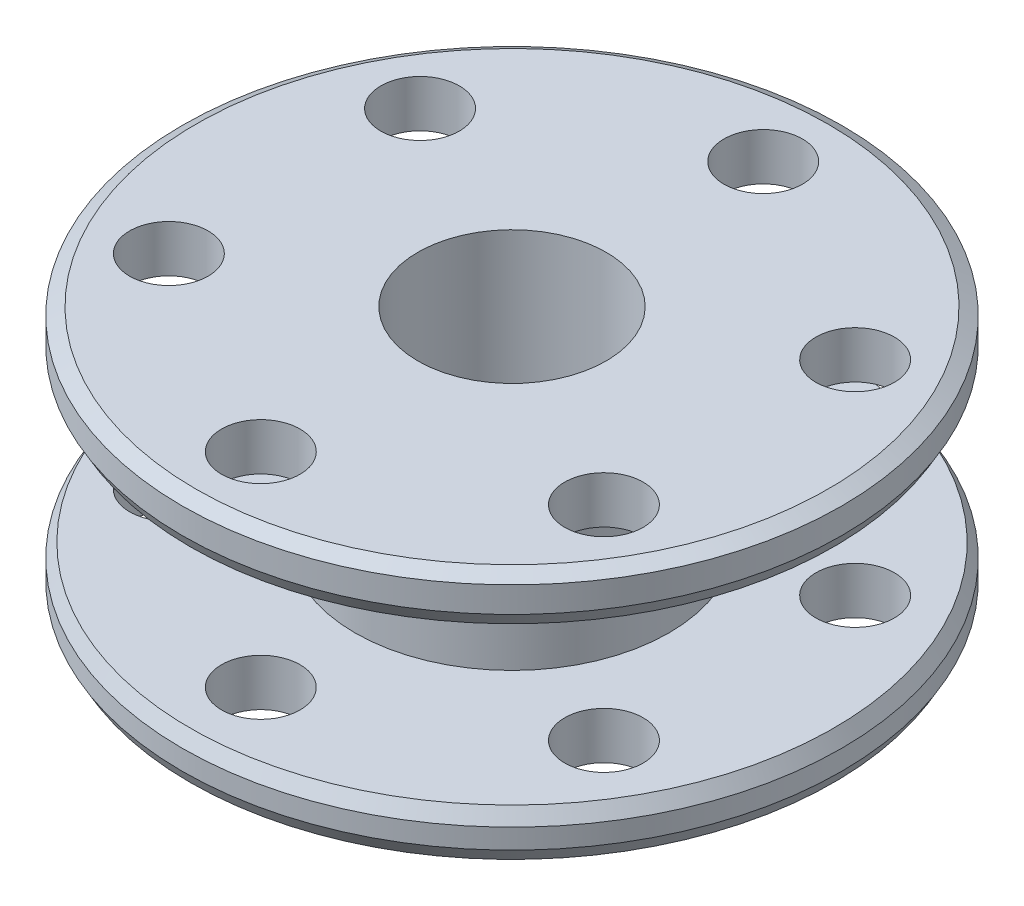
ISO-10303-21;
HEADER;
FILE_DESCRIPTION(('STEP AP214'),'2;1');
FILE_NAME('part.step','',(''),(''),'','','');
FILE_SCHEMA(('AUTOMOTIVE_DESIGN { 1 0 10303 214 1 1 1 1 }'));
ENDSEC;
DATA;
#1=APPLICATION_CONTEXT('core data for automotive mechanical design processes');
#2=APPLICATION_PROTOCOL_DEFINITION('international standard','automotive_design',2000,#1);
#3=PRODUCT_CONTEXT('',#1,'mechanical');
#4=PRODUCT('Part','Part','',(#3));
#5=PRODUCT_RELATED_PRODUCT_CATEGORY('part','',(#4));
#6=PRODUCT_DEFINITION_FORMATION('','',#4);
#7=PRODUCT_DEFINITION_CONTEXT('part definition',#1,'design');
#8=PRODUCT_DEFINITION('design','',#6,#7);
#9=PRODUCT_DEFINITION_SHAPE('','',#8);
#10=(LENGTH_UNIT() NAMED_UNIT(*) SI_UNIT(.MILLI.,.METRE.));
#11=(NAMED_UNIT(*) PLANE_ANGLE_UNIT() SI_UNIT($,.RADIAN.));
#12=(NAMED_UNIT(*) SI_UNIT($,.STERADIAN.) SOLID_ANGLE_UNIT());
#13=UNCERTAINTY_MEASURE_WITH_UNIT(LENGTH_MEASURE(1.E-05),#10,'distance_accuracy_value','');
#14=(GEOMETRIC_REPRESENTATION_CONTEXT(3) GLOBAL_UNCERTAINTY_ASSIGNED_CONTEXT((#13)) GLOBAL_UNIT_ASSIGNED_CONTEXT((#10,
#11,#12)) REPRESENTATION_CONTEXT('',''));
#15=CARTESIAN_POINT('',(0.,0.,0.));
#16=DIRECTION('',(0.,0.,1.));
#17=DIRECTION('',(1.,0.,0.));
#18=AXIS2_PLACEMENT_3D('',#15,#16,#17);
#19=CARTESIAN_POINT('',(0.,16.,0.));
#20=DIRECTION('',(0.,-1.,0.));
#21=DIRECTION('',(0.,0.,-1.));
#22=AXIS2_PLACEMENT_3D('',#19,#20,#21);
#23=CYLINDRICAL_SURFACE('',#22,21.);
#24=CARTESIAN_POINT('',(0.,0.86602540378445,0.));
#25=DIRECTION('',(0.,1.,0.));
#26=DIRECTION('',(0.,0.,1.));
#27=AXIS2_PLACEMENT_3D('',#24,#25,#26);
#28=CIRCLE('',#27,21.);
#29=CARTESIAN_POINT('',(0.,0.86602540378445,21.));
#30=VERTEX_POINT('',#29);
#31=EDGE_CURVE('E59',#30,#30,#28,.T.);
#32=ORIENTED_EDGE('',*,*,#31,.T.);
#33=EDGE_LOOP('',(#32));
#34=FACE_BOUND('',#33,.T.);
#35=CARTESIAN_POINT('',(0.,2.13397459621554,0.));
#36=DIRECTION('',(0.,-1.,0.));
#37=DIRECTION('',(0.,0.,-1.));
#38=AXIS2_PLACEMENT_3D('',#35,#36,#37);
#39=CIRCLE('',#38,21.);
#40=CARTESIAN_POINT('',(0.,2.13397459621554,-21.));
#41=VERTEX_POINT('',#40);
#42=EDGE_CURVE('E62',#41,#41,#39,.T.);
#43=ORIENTED_EDGE('',*,*,#42,.T.);
#44=EDGE_LOOP('',(#43));
#45=FACE_BOUND('',#44,.T.);
#46=ADVANCED_FACE('F32',(#34,#45),#23,.T.);
#47=CARTESIAN_POINT('',(0.,16.,-16.));
#48=DIRECTION('',(0.,-1.,0.));
#49=DIRECTION('',(0.,0.,-1.));
#50=AXIS2_PLACEMENT_3D('',#47,#48,#49);
#51=CYLINDRICAL_SURFACE('',#50,2.5);
#52=CARTESIAN_POINT('',(0.,3.,-16.));
#53=DIRECTION('',(0.,-1.,0.));
#54=DIRECTION('',(0.,0.,-1.));
#55=AXIS2_PLACEMENT_3D('',#52,#53,#54);
#56=CIRCLE('',#55,2.5);
#57=CARTESIAN_POINT('',(0.,3.,-18.5));
#58=VERTEX_POINT('',#57);
#59=EDGE_CURVE('E115',#58,#58,#56,.T.);
#60=ORIENTED_EDGE('',*,*,#59,.F.);
#61=EDGE_LOOP('',(#60));
#62=FACE_BOUND('',#61,.T.);
#63=CARTESIAN_POINT('',(0.,0.,-16.));
#64=DIRECTION('',(0.,1.,0.));
#65=DIRECTION('',(0.,0.,1.));
#66=AXIS2_PLACEMENT_3D('',#63,#64,#65);
#67=CIRCLE('',#66,2.5);
#68=CARTESIAN_POINT('',(0.,0.,-13.5));
#69=VERTEX_POINT('',#68);
#70=EDGE_CURVE('E82',#69,#69,#67,.T.);
#71=ORIENTED_EDGE('',*,*,#70,.F.);
#72=EDGE_LOOP('',(#71));
#73=FACE_BOUND('',#72,.T.);
#74=ADVANCED_FACE('F175',(#62,#73),#51,.F.);
#75=CARTESIAN_POINT('',(13.8564064605512,16.,-8.0000000000004));
#76=DIRECTION('',(0.,-1.,0.));
#77=DIRECTION('',(0.,0.,-1.));
#78=AXIS2_PLACEMENT_3D('',#75,#76,#77);
#79=CYLINDRICAL_SURFACE('',#78,2.50000000000014);
#80=CARTESIAN_POINT('',(13.8564064605512,3.,-8.0000000000004));
#81=DIRECTION('',(0.,-1.,0.));
#82=DIRECTION('',(0.,0.,-1.));
#83=AXIS2_PLACEMENT_3D('',#80,#81,#82);
#84=CIRCLE('',#83,2.50000000000014);
#85=CARTESIAN_POINT('',(13.8564064605512,3.,-10.5000000000005));
#86=VERTEX_POINT('',#85);
#87=EDGE_CURVE('E120',#86,#86,#84,.T.);
#88=ORIENTED_EDGE('',*,*,#87,.F.);
#89=EDGE_LOOP('',(#88));
#90=FACE_BOUND('',#89,.T.);
#91=CARTESIAN_POINT('',(13.8564064605512,0.,-8.0000000000004));
#92=DIRECTION('',(0.,1.,0.));
#93=DIRECTION('',(0.,0.,1.));
#94=AXIS2_PLACEMENT_3D('',#91,#92,#93);
#95=CIRCLE('',#94,2.50000000000014);
#96=CARTESIAN_POINT('',(13.8564064605512,0.,-5.50000000000025));
#97=VERTEX_POINT('',#96);
#98=EDGE_CURVE('E88',#97,#97,#95,.T.);
#99=ORIENTED_EDGE('',*,*,#98,.F.);
#100=EDGE_LOOP('',(#99));
#101=FACE_BOUND('',#100,.T.);
#102=ADVANCED_FACE('F218',(#90,#101),#79,.F.);
#103=CARTESIAN_POINT('',(13.8564064605517,16.,7.99999999999961));
#104=DIRECTION('',(0.,-1.,0.));
#105=DIRECTION('',(0.,0.,-1.));
#106=AXIS2_PLACEMENT_3D('',#103,#104,#105);
#107=CYLINDRICAL_SURFACE('',#106,2.50000000000061);
#108=CARTESIAN_POINT('',(13.8564064605517,3.,7.99999999999961));
#109=DIRECTION('',(0.,-1.,0.));
#110=DIRECTION('',(0.,0.,-1.));
#111=AXIS2_PLACEMENT_3D('',#108,#109,#110);
#112=CIRCLE('',#111,2.50000000000061);
#113=CARTESIAN_POINT('',(13.8564064605517,3.,5.499999999999));
#114=VERTEX_POINT('',#113);
#115=EDGE_CURVE('E123',#114,#114,#112,.T.);
#116=ORIENTED_EDGE('',*,*,#115,.F.);
#117=EDGE_LOOP('',(#116));
#118=FACE_BOUND('',#117,.T.);
#119=CARTESIAN_POINT('',(13.8564064605517,0.,7.99999999999961));
#120=DIRECTION('',(0.,1.,0.));
#121=DIRECTION('',(0.,0.,1.));
#122=AXIS2_PLACEMENT_3D('',#119,#120,#121);
#123=CIRCLE('',#122,2.50000000000061);
#124=CARTESIAN_POINT('',(13.8564064605517,0.,10.5000000000002));
#125=VERTEX_POINT('',#124);
#126=EDGE_CURVE('E94',#125,#125,#123,.T.);
#127=ORIENTED_EDGE('',*,*,#126,.F.);
#128=EDGE_LOOP('',(#127));
#129=FACE_BOUND('',#128,.T.);
#130=ADVANCED_FACE('F289',(#118,#129),#107,.F.);
#131=CARTESIAN_POINT('',(9.03616397137021E-13,16.,16.));
#132=DIRECTION('',(0.,-1.,0.));
#133=DIRECTION('',(0.,0.,-1.));
#134=AXIS2_PLACEMENT_3D('',#131,#132,#133);
#135=CYLINDRICAL_SURFACE('',#134,2.50000000000097);
#136=CARTESIAN_POINT('',(9.03616397137021E-13,3.,16.));
#137=DIRECTION('',(0.,-1.,0.));
#138=DIRECTION('',(0.,0.,-1.));
#139=AXIS2_PLACEMENT_3D('',#136,#137,#138);
#140=CIRCLE('',#139,2.50000000000097);
#141=CARTESIAN_POINT('',(9.03616397137021E-13,3.,13.499999999999));
#142=VERTEX_POINT('',#141);
#143=EDGE_CURVE('E126',#142,#142,#140,.T.);
#144=ORIENTED_EDGE('',*,*,#143,.F.);
#145=EDGE_LOOP('',(#144));
#146=FACE_BOUND('',#145,.T.);
#147=CARTESIAN_POINT('',(9.03616397137021E-13,0.,16.));
#148=DIRECTION('',(0.,1.,0.));
#149=DIRECTION('',(0.,0.,1.));
#150=AXIS2_PLACEMENT_3D('',#147,#148,#149);
#151=CIRCLE('',#150,2.50000000000097);
#152=CARTESIAN_POINT('',(9.03616397137021E-13,0.,18.500000000001));
#153=VERTEX_POINT('',#152);
#154=EDGE_CURVE('E100',#153,#153,#151,.T.);
#155=ORIENTED_EDGE('',*,*,#154,.F.);
#156=EDGE_LOOP('',(#155));
#157=FACE_BOUND('',#156,.T.);
#158=ADVANCED_FACE('F284',(#146,#157),#135,.F.);
#159=CARTESIAN_POINT('',(-13.8564064605503,16.,8.0000000000004));
#160=DIRECTION('',(0.,-1.,0.));
#161=DIRECTION('',(0.,0.,-1.));
#162=AXIS2_PLACEMENT_3D('',#159,#160,#161);
#163=CYLINDRICAL_SURFACE('',#162,2.50000000000091);
#164=CARTESIAN_POINT('',(-13.8564064605503,3.,8.0000000000004));
#165=DIRECTION('',(0.,-1.,0.));
#166=DIRECTION('',(0.,0.,-1.));
#167=AXIS2_PLACEMENT_3D('',#164,#165,#166);
#168=CIRCLE('',#167,2.50000000000091);
#169=CARTESIAN_POINT('',(-13.8564064605503,3.,5.49999999999949));
#170=VERTEX_POINT('',#169);
#171=EDGE_CURVE('E69',#170,#170,#168,.T.);
#172=ORIENTED_EDGE('',*,*,#171,.F.);
#173=EDGE_LOOP('',(#172));
#174=FACE_BOUND('',#173,.T.);
#175=CARTESIAN_POINT('',(-13.8564064605503,0.,8.0000000000004));
#176=DIRECTION('',(0.,1.,0.));
#177=DIRECTION('',(0.,0.,1.));
#178=AXIS2_PLACEMENT_3D('',#175,#176,#177);
#179=CIRCLE('',#178,2.50000000000091);
#180=CARTESIAN_POINT('',(-13.8564064605503,0.,10.5000000000013));
#181=VERTEX_POINT('',#180);
#182=EDGE_CURVE('E106',#181,#181,#179,.T.);
#183=ORIENTED_EDGE('',*,*,#182,.F.);
#184=EDGE_LOOP('',(#183));
#185=FACE_BOUND('',#184,.T.);
#186=ADVANCED_FACE('F207',(#174,#185),#163,.F.);
#187=CARTESIAN_POINT('',(-13.8564064605508,16.,-7.9999999999996));
#188=DIRECTION('',(0.,-1.,0.));
#189=DIRECTION('',(0.,0.,-1.));
#190=AXIS2_PLACEMENT_3D('',#187,#188,#189);
#191=CYLINDRICAL_SURFACE('',#190,2.50000000000052);
#192=CARTESIAN_POINT('',(-13.8564064605508,3.,-7.9999999999996));
#193=DIRECTION('',(0.,-1.,0.));
#194=DIRECTION('',(0.,0.,-1.));
#195=AXIS2_PLACEMENT_3D('',#192,#193,#194);
#196=CIRCLE('',#195,2.50000000000052);
#197=CARTESIAN_POINT('',(-13.8564064605508,3.,-10.5000000000001));
#198=VERTEX_POINT('',#197);
#199=EDGE_CURVE('E66',#198,#198,#196,.T.);
#200=ORIENTED_EDGE('',*,*,#199,.F.);
#201=EDGE_LOOP('',(#200));
#202=FACE_BOUND('',#201,.T.);
#203=CARTESIAN_POINT('',(-13.8564064605508,0.,-7.9999999999996));
#204=DIRECTION('',(0.,1.,0.));
#205=DIRECTION('',(0.,0.,1.));
#206=AXIS2_PLACEMENT_3D('',#203,#204,#205);
#207=CIRCLE('',#206,2.50000000000052);
#208=CARTESIAN_POINT('',(-13.8564064605508,0.,-5.49999999999908));
#209=VERTEX_POINT('',#208);
#210=EDGE_CURVE('E112',#209,#209,#207,.T.);
#211=ORIENTED_EDGE('',*,*,#210,.F.);
#212=EDGE_LOOP('',(#211));
#213=FACE_BOUND('',#212,.T.);
#214=ADVANCED_FACE('F182',(#202,#213),#191,.F.);
#215=CARTESIAN_POINT('',(0.,16.,0.));
#216=DIRECTION('',(0.,1.,0.));
#217=DIRECTION('',(0.,0.,1.));
#218=AXIS2_PLACEMENT_3D('',#215,#216,#217);
#219=PLANE('',#218);
#220=CARTESIAN_POINT('',(0.,16.,0.));
#221=DIRECTION('',(0.,1.,0.));
#222=DIRECTION('',(0.,0.,1.));
#223=AXIS2_PLACEMENT_3D('',#220,#221,#222);
#224=CIRCLE('',#223,20.1339745962156);
#225=CARTESIAN_POINT('',(0.,16.,20.1339745962156));
#226=VERTEX_POINT('',#225);
#227=EDGE_CURVE('E48',#226,#226,#224,.T.);
#228=ORIENTED_EDGE('',*,*,#227,.T.);
#229=EDGE_LOOP('',(#228));
#230=FACE_BOUND('',#229,.T.);
#231=CARTESIAN_POINT('',(-13.8564064605503,16.,8.0000000000004));
#232=DIRECTION('',(0.,1.,0.));
#233=DIRECTION('',(0.,0.,1.));
#234=AXIS2_PLACEMENT_3D('',#231,#232,#233);
#235=CIRCLE('',#234,2.50000000000091);
#236=CARTESIAN_POINT('',(-13.8564064605503,16.,10.5000000000013));
#237=VERTEX_POINT('',#236);
#238=EDGE_CURVE('E103',#237,#237,#235,.T.);
#239=ORIENTED_EDGE('',*,*,#238,.F.);
#240=EDGE_LOOP('',(#239));
#241=FACE_BOUND('',#240,.T.);
#242=CARTESIAN_POINT('',(13.8564064605517,16.,7.99999999999961));
#243=DIRECTION('',(0.,1.,0.));
#244=DIRECTION('',(0.,0.,1.));
#245=AXIS2_PLACEMENT_3D('',#242,#243,#244);
#246=CIRCLE('',#245,2.50000000000061);
#247=CARTESIAN_POINT('',(13.8564064605517,16.,10.5000000000002));
#248=VERTEX_POINT('',#247);
#249=EDGE_CURVE('E91',#248,#248,#246,.T.);
#250=ORIENTED_EDGE('',*,*,#249,.F.);
#251=EDGE_LOOP('',(#250));
#252=FACE_BOUND('',#251,.T.);
#253=CARTESIAN_POINT('',(0.,16.,-16.));
#254=DIRECTION('',(0.,1.,0.));
#255=DIRECTION('',(0.,0.,1.));
#256=AXIS2_PLACEMENT_3D('',#253,#254,#255);
#257=CIRCLE('',#256,2.5);
#258=CARTESIAN_POINT('',(0.,16.,-13.5));
#259=VERTEX_POINT('',#258);
#260=EDGE_CURVE('E79',#259,#259,#257,.T.);
#261=ORIENTED_EDGE('',*,*,#260,.F.);
#262=EDGE_LOOP('',(#261));
#263=FACE_BOUND('',#262,.T.);
#264=CARTESIAN_POINT('',(0.,16.,0.));
#265=DIRECTION('',(0.,1.,0.));
#266=DIRECTION('',(0.,0.,1.));
#267=AXIS2_PLACEMENT_3D('',#264,#265,#266);
#268=CIRCLE('',#267,6.);
#269=CARTESIAN_POINT('',(0.,16.,6.));
#270=VERTEX_POINT('',#269);
#271=EDGE_CURVE('E65',#270,#270,#268,.T.);
#272=ORIENTED_EDGE('',*,*,#271,.F.);
#273=EDGE_LOOP('',(#272));
#274=FACE_BOUND('',#273,.T.);
#275=CARTESIAN_POINT('',(13.8564064605512,16.,-8.0000000000004));
#276=DIRECTION('',(0.,1.,0.));
#277=DIRECTION('',(0.,0.,1.));
#278=AXIS2_PLACEMENT_3D('',#275,#276,#277);
#279=CIRCLE('',#278,2.50000000000014);
#280=CARTESIAN_POINT('',(13.8564064605512,16.,-5.50000000000025));
#281=VERTEX_POINT('',#280);
#282=EDGE_CURVE('E85',#281,#281,#279,.T.);
#283=ORIENTED_EDGE('',*,*,#282,.F.);
#284=EDGE_LOOP('',(#283));
#285=FACE_BOUND('',#284,.T.);
#286=CARTESIAN_POINT('',(9.03616397137021E-13,16.,16.));
#287=DIRECTION('',(0.,1.,0.));
#288=DIRECTION('',(0.,0.,1.));
#289=AXIS2_PLACEMENT_3D('',#286,#287,#288);
#290=CIRCLE('',#289,2.50000000000097);
#291=CARTESIAN_POINT('',(9.03616397137021E-13,16.,18.500000000001));
#292=VERTEX_POINT('',#291);
#293=EDGE_CURVE('E97',#292,#292,#290,.T.);
#294=ORIENTED_EDGE('',*,*,#293,.F.);
#295=EDGE_LOOP('',(#294));
#296=FACE_BOUND('',#295,.T.);
#297=CARTESIAN_POINT('',(-13.8564064605508,16.,-7.9999999999996));
#298=DIRECTION('',(0.,1.,0.));
#299=DIRECTION('',(0.,0.,1.));
#300=AXIS2_PLACEMENT_3D('',#297,#298,#299);
#301=CIRCLE('',#300,2.50000000000052);
#302=CARTESIAN_POINT('',(-13.8564064605508,16.,-5.49999999999908));
#303=VERTEX_POINT('',#302);
#304=EDGE_CURVE('E109',#303,#303,#301,.T.);
#305=ORIENTED_EDGE('',*,*,#304,.F.);
#306=EDGE_LOOP('',(#305));
#307=FACE_BOUND('',#306,.T.);
#308=ADVANCED_FACE('F178',(#230,#241,#252,#263,#274,#285,#296,#307),#219,.T.);
#309=CARTESIAN_POINT('',(0.,0.,0.));
#310=DIRECTION('',(0.,1.,0.));
#311=DIRECTION('',(0.,0.,1.));
#312=AXIS2_PLACEMENT_3D('',#309,#310,#311);
#313=PLANE('',#312);
#314=CARTESIAN_POINT('',(0.,0.,0.));
#315=DIRECTION('',(0.,1.,0.));
#316=DIRECTION('',(0.,0.,1.));
#317=AXIS2_PLACEMENT_3D('',#314,#315,#316);
#318=CIRCLE('',#317,20.5);
#319=CARTESIAN_POINT('',(0.,0.,20.5));
#320=VERTEX_POINT('',#319);
#321=EDGE_CURVE('E56',#320,#320,#318,.F.);
#322=ORIENTED_EDGE('',*,*,#321,.T.);
#323=EDGE_LOOP('',(#322));
#324=FACE_BOUND('',#323,.T.);
#325=CARTESIAN_POINT('',(0.,0.,0.));
#326=DIRECTION('',(0.,1.,0.));
#327=DIRECTION('',(0.,0.,1.));
#328=AXIS2_PLACEMENT_3D('',#325,#326,#327);
#329=CIRCLE('',#328,6.);
#330=CARTESIAN_POINT('',(0.,0.,6.));
#331=VERTEX_POINT('',#330);
#332=EDGE_CURVE('E76',#331,#331,#329,.T.);
#333=ORIENTED_EDGE('',*,*,#332,.T.);
#334=EDGE_LOOP('',(#333));
#335=FACE_BOUND('',#334,.T.);
#336=ORIENTED_EDGE('',*,*,#70,.T.);
#337=EDGE_LOOP('',(#336));
#338=FACE_BOUND('',#337,.T.);
#339=ORIENTED_EDGE('',*,*,#98,.T.);
#340=EDGE_LOOP('',(#339));
#341=FACE_BOUND('',#340,.T.);
#342=ORIENTED_EDGE('',*,*,#126,.T.);
#343=EDGE_LOOP('',(#342));
#344=FACE_BOUND('',#343,.T.);
#345=ORIENTED_EDGE('',*,*,#154,.T.);
#346=EDGE_LOOP('',(#345));
#347=FACE_BOUND('',#346,.T.);
#348=ORIENTED_EDGE('',*,*,#182,.T.);
#349=EDGE_LOOP('',(#348));
#350=FACE_BOUND('',#349,.T.);
#351=ORIENTED_EDGE('',*,*,#210,.T.);
#352=EDGE_LOOP('',(#351));
#353=FACE_BOUND('',#352,.T.);
#354=ADVANCED_FACE('F181',(#324,#335,#338,#341,#344,#347,#350,#353),#313,.F.);
#355=CARTESIAN_POINT('',(0.,15.5,0.));
#356=DIRECTION('',(0.,1.,0.));
#357=DIRECTION('',(0.,0.,1.));
#358=AXIS2_PLACEMENT_3D('',#355,#356,#357);
#359=CIRCLE('',#358,21.);
#360=CARTESIAN_POINT('',(0.,15.5,21.));
#361=VERTEX_POINT('',#360);
#362=EDGE_CURVE('E40',#361,#361,#359,.F.);
#363=ORIENTED_EDGE('',*,*,#362,.T.);
#364=EDGE_LOOP('',(#363));
#365=FACE_BOUND('',#364,.T.);
#366=CARTESIAN_POINT('',(0.,13.8660254037845,0.));
#367=DIRECTION('',(0.,1.,0.));
#368=DIRECTION('',(0.,0.,1.));
#369=AXIS2_PLACEMENT_3D('',#366,#367,#368);
#370=CIRCLE('',#369,21.);
#371=CARTESIAN_POINT('',(0.,13.8660254037845,21.));
#372=VERTEX_POINT('',#371);
#373=EDGE_CURVE('E44',#372,#372,#370,.T.);
#374=ORIENTED_EDGE('',*,*,#373,.T.);
#375=EDGE_LOOP('',(#374));
#376=FACE_BOUND('',#375,.T.);
#377=ADVANCED_FACE('F214',(#365,#376),#23,.T.);
#378=CARTESIAN_POINT('',(0.,16.,0.));
#379=DIRECTION('',(0.,-1.,0.));
#380=DIRECTION('',(0.,0.,-1.));
#381=AXIS2_PLACEMENT_3D('',#378,#379,#380);
#382=CYLINDRICAL_SURFACE('',#381,6.);
#383=ORIENTED_EDGE('',*,*,#271,.T.);
#384=EDGE_LOOP('',(#383));
#385=FACE_BOUND('',#384,.T.);
#386=ORIENTED_EDGE('',*,*,#332,.F.);
#387=EDGE_LOOP('',(#386));
#388=FACE_BOUND('',#387,.T.);
#389=ADVANCED_FACE('F173',(#385,#388),#382,.F.);
#390=CARTESIAN_POINT('',(0.,13.,-16.));
#391=DIRECTION('',(0.,1.,0.));
#392=DIRECTION('',(0.,0.,1.));
#393=AXIS2_PLACEMENT_3D('',#390,#391,#392);
#394=CIRCLE('',#393,2.5);
#395=CARTESIAN_POINT('',(0.,13.,-13.5));
#396=VERTEX_POINT('',#395);
#397=EDGE_CURVE('E70',#396,#396,#394,.T.);
#398=ORIENTED_EDGE('',*,*,#397,.F.);
#399=EDGE_LOOP('',(#398));
#400=FACE_BOUND('',#399,.T.);
#401=ORIENTED_EDGE('',*,*,#260,.T.);
#402=EDGE_LOOP('',(#401));
#403=FACE_BOUND('',#402,.T.);
#404=ADVANCED_FACE('F169',(#400,#403),#51,.F.);
#405=CARTESIAN_POINT('',(13.8564064605512,13.,-8.0000000000004));
#406=DIRECTION('',(0.,1.,0.));
#407=DIRECTION('',(0.,0.,1.));
#408=AXIS2_PLACEMENT_3D('',#405,#406,#407);
#409=CIRCLE('',#408,2.50000000000014);
#410=CARTESIAN_POINT('',(13.8564064605512,13.,-5.50000000000025));
#411=VERTEX_POINT('',#410);
#412=EDGE_CURVE('E133',#411,#411,#409,.T.);
#413=ORIENTED_EDGE('',*,*,#412,.F.);
#414=EDGE_LOOP('',(#413));
#415=FACE_BOUND('',#414,.T.);
#416=ORIENTED_EDGE('',*,*,#282,.T.);
#417=EDGE_LOOP('',(#416));
#418=FACE_BOUND('',#417,.T.);
#419=ADVANCED_FACE('F172',(#415,#418),#79,.F.);
#420=CARTESIAN_POINT('',(13.8564064605517,13.,7.99999999999961));
#421=DIRECTION('',(0.,1.,0.));
#422=DIRECTION('',(0.,0.,1.));
#423=AXIS2_PLACEMENT_3D('',#420,#421,#422);
#424=CIRCLE('',#423,2.50000000000061);
#425=CARTESIAN_POINT('',(13.8564064605517,13.,10.5000000000002));
#426=VERTEX_POINT('',#425);
#427=EDGE_CURVE('E136',#426,#426,#424,.T.);
#428=ORIENTED_EDGE('',*,*,#427,.F.);
#429=EDGE_LOOP('',(#428));
#430=FACE_BOUND('',#429,.T.);
#431=ORIENTED_EDGE('',*,*,#249,.T.);
#432=EDGE_LOOP('',(#431));
#433=FACE_BOUND('',#432,.T.);
#434=ADVANCED_FACE('F295',(#430,#433),#107,.F.);
#435=CARTESIAN_POINT('',(9.03616397137021E-13,13.,16.));
#436=DIRECTION('',(0.,1.,0.));
#437=DIRECTION('',(0.,0.,1.));
#438=AXIS2_PLACEMENT_3D('',#435,#436,#437);
#439=CIRCLE('',#438,2.50000000000097);
#440=CARTESIAN_POINT('',(9.03616397137021E-13,13.,18.500000000001));
#441=VERTEX_POINT('',#440);
#442=EDGE_CURVE('E139',#441,#441,#439,.T.);
#443=ORIENTED_EDGE('',*,*,#442,.F.);
#444=EDGE_LOOP('',(#443));
#445=FACE_BOUND('',#444,.T.);
#446=ORIENTED_EDGE('',*,*,#293,.T.);
#447=EDGE_LOOP('',(#446));
#448=FACE_BOUND('',#447,.T.);
#449=ADVANCED_FACE('F204',(#445,#448),#135,.F.);
#450=CARTESIAN_POINT('',(-13.8564064605503,13.,8.0000000000004));
#451=DIRECTION('',(0.,1.,0.));
#452=DIRECTION('',(0.,0.,1.));
#453=AXIS2_PLACEMENT_3D('',#450,#451,#452);
#454=CIRCLE('',#453,2.50000000000091);
#455=CARTESIAN_POINT('',(-13.8564064605503,13.,10.5000000000013));
#456=VERTEX_POINT('',#455);
#457=EDGE_CURVE('E74',#456,#456,#454,.T.);
#458=ORIENTED_EDGE('',*,*,#457,.F.);
#459=EDGE_LOOP('',(#458));
#460=FACE_BOUND('',#459,.T.);
#461=ORIENTED_EDGE('',*,*,#238,.T.);
#462=EDGE_LOOP('',(#461));
#463=FACE_BOUND('',#462,.T.);
#464=ADVANCED_FACE('F195',(#460,#463),#163,.F.);
#465=CARTESIAN_POINT('',(-13.8564064605508,13.,-7.9999999999996));
#466=DIRECTION('',(0.,1.,0.));
#467=DIRECTION('',(0.,0.,1.));
#468=AXIS2_PLACEMENT_3D('',#465,#466,#467);
#469=CIRCLE('',#468,2.50000000000052);
#470=CARTESIAN_POINT('',(-13.8564064605508,13.,-5.49999999999908));
#471=VERTEX_POINT('',#470);
#472=EDGE_CURVE('E71',#471,#471,#469,.T.);
#473=ORIENTED_EDGE('',*,*,#472,.F.);
#474=EDGE_LOOP('',(#473));
#475=FACE_BOUND('',#474,.T.);
#476=ORIENTED_EDGE('',*,*,#304,.T.);
#477=EDGE_LOOP('',(#476));
#478=FACE_BOUND('',#477,.T.);
#479=ADVANCED_FACE('F193',(#475,#478),#191,.F.);
#480=CARTESIAN_POINT('',(0.,3.,-10.));
#481=DIRECTION('',(0.,-1.,0.));
#482=DIRECTION('',(0.,0.,-1.));
#483=AXIS2_PLACEMENT_3D('',#480,#481,#482);
#484=PLANE('',#483);
#485=CARTESIAN_POINT('',(0.,3.,0.));
#486=DIRECTION('',(0.,-1.,0.));
#487=DIRECTION('',(0.,0.,-1.));
#488=AXIS2_PLACEMENT_3D('',#485,#486,#487);
#489=CIRCLE('',#488,20.5);
#490=CARTESIAN_POINT('',(0.,3.,-20.5));
#491=VERTEX_POINT('',#490);
#492=EDGE_CURVE('E53',#491,#491,#489,.F.);
#493=ORIENTED_EDGE('',*,*,#492,.T.);
#494=EDGE_LOOP('',(#493));
#495=FACE_BOUND('',#494,.T.);
#496=CARTESIAN_POINT('',(0.,3.,0.));
#497=DIRECTION('',(0.,-1.,0.));
#498=DIRECTION('',(0.,0.,-1.));
#499=AXIS2_PLACEMENT_3D('',#496,#497,#498);
#500=CIRCLE('',#499,10.);
#501=CARTESIAN_POINT('',(0.,3.,-10.));
#502=VERTEX_POINT('',#501);
#503=EDGE_CURVE('E75',#502,#502,#500,.T.);
#504=ORIENTED_EDGE('',*,*,#503,.T.);
#505=EDGE_LOOP('',(#504));
#506=FACE_BOUND('',#505,.T.);
#507=ORIENTED_EDGE('',*,*,#199,.T.);
#508=EDGE_LOOP('',(#507));
#509=FACE_BOUND('',#508,.T.);
#510=ORIENTED_EDGE('',*,*,#171,.T.);
#511=EDGE_LOOP('',(#510));
#512=FACE_BOUND('',#511,.T.);
#513=ORIENTED_EDGE('',*,*,#143,.T.);
#514=EDGE_LOOP('',(#513));
#515=FACE_BOUND('',#514,.T.);
#516=ORIENTED_EDGE('',*,*,#115,.T.);
#517=EDGE_LOOP('',(#516));
#518=FACE_BOUND('',#517,.T.);
#519=ORIENTED_EDGE('',*,*,#87,.T.);
#520=EDGE_LOOP('',(#519));
#521=FACE_BOUND('',#520,.T.);
#522=ORIENTED_EDGE('',*,*,#59,.T.);
#523=EDGE_LOOP('',(#522));
#524=FACE_BOUND('',#523,.T.);
#525=ADVANCED_FACE('F155',(#495,#506,#509,#512,#515,#518,#521,#524),#484,.F.);
#526=CARTESIAN_POINT('',(0.,13.,-10.));
#527=DIRECTION('',(0.,1.,0.));
#528=DIRECTION('',(0.,0.,1.));
#529=AXIS2_PLACEMENT_3D('',#526,#527,#528);
#530=PLANE('',#529);
#531=CARTESIAN_POINT('',(0.,13.,0.));
#532=DIRECTION('',(0.,1.,0.));
#533=DIRECTION('',(0.,0.,1.));
#534=AXIS2_PLACEMENT_3D('',#531,#532,#533);
#535=CIRCLE('',#534,20.5);
#536=CARTESIAN_POINT('',(0.,13.,20.5));
#537=VERTEX_POINT('',#536);
#538=EDGE_CURVE('E10',#537,#537,#535,.F.);
#539=ORIENTED_EDGE('',*,*,#538,.T.);
#540=EDGE_LOOP('',(#539));
#541=FACE_BOUND('',#540,.T.);
#542=CARTESIAN_POINT('',(0.,13.,0.));
#543=DIRECTION('',(0.,-1.,0.));
#544=DIRECTION('',(0.,0.,-1.));
#545=AXIS2_PLACEMENT_3D('',#542,#543,#544);
#546=CIRCLE('',#545,10.);
#547=CARTESIAN_POINT('',(0.,13.,-10.));
#548=VERTEX_POINT('',#547);
#549=EDGE_CURVE('E146',#548,#548,#546,.T.);
#550=ORIENTED_EDGE('',*,*,#549,.F.);
#551=EDGE_LOOP('',(#550));
#552=FACE_BOUND('',#551,.T.);
#553=ORIENTED_EDGE('',*,*,#472,.T.);
#554=EDGE_LOOP('',(#553));
#555=FACE_BOUND('',#554,.T.);
#556=ORIENTED_EDGE('',*,*,#457,.T.);
#557=EDGE_LOOP('',(#556));
#558=FACE_BOUND('',#557,.T.);
#559=ORIENTED_EDGE('',*,*,#442,.T.);
#560=EDGE_LOOP('',(#559));
#561=FACE_BOUND('',#560,.T.);
#562=ORIENTED_EDGE('',*,*,#427,.T.);
#563=EDGE_LOOP('',(#562));
#564=FACE_BOUND('',#563,.T.);
#565=ORIENTED_EDGE('',*,*,#412,.T.);
#566=EDGE_LOOP('',(#565));
#567=FACE_BOUND('',#566,.T.);
#568=ORIENTED_EDGE('',*,*,#397,.T.);
#569=EDGE_LOOP('',(#568));
#570=FACE_BOUND('',#569,.T.);
#571=ADVANCED_FACE('F152',(#541,#552,#555,#558,#561,#564,#567,#570),#530,.F.);
#572=CARTESIAN_POINT('',(0.,0.,0.));
#573=DIRECTION('',(0.,-1.,0.));
#574=DIRECTION('',(0.,0.,-1.));
#575=AXIS2_PLACEMENT_3D('',#572,#573,#574);
#576=CYLINDRICAL_SURFACE('',#575,10.);
#577=ORIENTED_EDGE('',*,*,#503,.F.);
#578=EDGE_LOOP('',(#577));
#579=FACE_BOUND('',#578,.T.);
#580=ORIENTED_EDGE('',*,*,#549,.T.);
#581=EDGE_LOOP('',(#580));
#582=FACE_BOUND('',#581,.T.);
#583=ADVANCED_FACE('F150',(#579,#582),#576,.T.);
#584=CARTESIAN_POINT('',(0.,0.86602540378445,0.));
#585=DIRECTION('',(0.,1.,0.));
#586=DIRECTION('',(0.,0.,1.));
#587=AXIS2_PLACEMENT_3D('',#584,#585,#586);
#588=CONICAL_SURFACE('',#587,21.,0.523598775598297);
#589=ORIENTED_EDGE('',*,*,#321,.F.);
#590=EDGE_LOOP('',(#589));
#591=FACE_BOUND('',#590,.T.);
#592=ORIENTED_EDGE('',*,*,#31,.F.);
#593=EDGE_LOOP('',(#592));
#594=FACE_BOUND('',#593,.T.);
#595=ADVANCED_FACE('F245',(#591,#594),#588,.T.);
#596=CARTESIAN_POINT('',(0.,2.13397459621554,0.));
#597=DIRECTION('',(0.,-1.,0.));
#598=DIRECTION('',(0.,0.,-1.));
#599=AXIS2_PLACEMENT_3D('',#596,#597,#598);
#600=CONICAL_SURFACE('',#599,21.,0.523598775598293);
#601=ORIENTED_EDGE('',*,*,#492,.F.);
#602=EDGE_LOOP('',(#601));
#603=FACE_BOUND('',#602,.T.);
#604=ORIENTED_EDGE('',*,*,#42,.F.);
#605=EDGE_LOOP('',(#604));
#606=FACE_BOUND('',#605,.T.);
#607=ADVANCED_FACE('F240',(#603,#606),#600,.T.);
#608=CARTESIAN_POINT('',(0.,16.,0.));
#609=DIRECTION('',(0.,-1.,0.));
#610=DIRECTION('',(0.,0.,-1.));
#611=AXIS2_PLACEMENT_3D('',#608,#609,#610);
#612=CONICAL_SURFACE('',#611,20.1339745962156,1.04719755119659);
#613=ORIENTED_EDGE('',*,*,#362,.F.);
#614=EDGE_LOOP('',(#613));
#615=FACE_BOUND('',#614,.T.);
#616=ORIENTED_EDGE('',*,*,#227,.F.);
#617=EDGE_LOOP('',(#616));
#618=FACE_BOUND('',#617,.T.);
#619=ADVANCED_FACE('F235',(#615,#618),#612,.T.);
#620=CARTESIAN_POINT('',(0.,13.8660254037845,0.));
#621=DIRECTION('',(0.,1.,0.));
#622=DIRECTION('',(0.,0.,1.));
#623=AXIS2_PLACEMENT_3D('',#620,#621,#622);
#624=CONICAL_SURFACE('',#623,21.,0.523598775598294);
#625=CARTESIAN_POINT('',(0.,13.,20.5));
#626=CARTESIAN_POINT('',(0.,13.0090210979561,20.5052083333333));
#627=CARTESIAN_POINT('',(0.,13.0180421959122,20.5104166666667));
#628=CARTESIAN_POINT('',(0.,13.0360843918244,20.5208333333333));
#629=CARTESIAN_POINT('',(0.,13.0451054897804,20.5260416666667));
#630=CARTESIAN_POINT('',(0.,13.0631476856926,20.5364583333333));
#631=CARTESIAN_POINT('',(0.,13.0721687836487,20.5416666666667));
#632=CARTESIAN_POINT('',(0.,13.0902109795609,20.5520833333333));
#633=CARTESIAN_POINT('',(0.,13.099232077517,20.5572916666667));
#634=CARTESIAN_POINT('',(0.,13.1172742734291,20.5677083333333));
#635=CARTESIAN_POINT('',(0.,13.1262953713852,20.5729166666667));
#636=CARTESIAN_POINT('',(0.,13.1443375672974,20.5833333333333));
#637=CARTESIAN_POINT('',(0.,13.1533586652535,20.5885416666667));
#638=CARTESIAN_POINT('',(0.,13.1714008611657,20.5989583333333));
#639=CARTESIAN_POINT('',(0.,13.1804219591218,20.6041666666667));
#640=CARTESIAN_POINT('',(0.,13.1984641550339,20.6145833333333));
#641=CARTESIAN_POINT('',(0.,13.20748525299,20.6197916666667));
#642=CARTESIAN_POINT('',(0.,13.2255274489022,20.6302083333333));
#643=CARTESIAN_POINT('',(0.,13.2345485468583,20.6354166666667));
#644=CARTESIAN_POINT('',(0.,13.2525907427705,20.6458333333333));
#645=CARTESIAN_POINT('',(0.,13.2616118407266,20.6510416666667));
#646=CARTESIAN_POINT('',(0.,13.2796540366387,20.6614583333333));
#647=CARTESIAN_POINT('',(0.,13.2886751345948,20.6666666666667));
#648=CARTESIAN_POINT('',(0.,13.306717330507,20.6770833333333));
#649=CARTESIAN_POINT('',(0.,13.3157384284631,20.6822916666667));
#650=CARTESIAN_POINT('',(0.,13.3337806243753,20.6927083333333));
#651=CARTESIAN_POINT('',(0.,13.3428017223313,20.6979166666667));
#652=CARTESIAN_POINT('',(0.,13.3608439182435,20.7083333333333));
#653=CARTESIAN_POINT('',(0.,13.3698650161996,20.7135416666667));
#654=CARTESIAN_POINT('',(0.,13.3879072121118,20.7239583333333));
#655=CARTESIAN_POINT('',(0.,13.3969283100679,20.7291666666667));
#656=CARTESIAN_POINT('',(0.,13.4149705059801,20.7395833333333));
#657=CARTESIAN_POINT('',(0.,13.4239916039361,20.7447916666667));
#658=CARTESIAN_POINT('',(0.,13.4420337998483,20.7552083333333));
#659=CARTESIAN_POINT('',(0.,13.4510548978044,20.7604166666667));
#660=CARTESIAN_POINT('',(0.,13.4690970937166,20.7708333333333));
#661=CARTESIAN_POINT('',(0.,13.4781181916727,20.7760416666667));
#662=CARTESIAN_POINT('',(0.,13.4961603875848,20.7864583333333));
#663=CARTESIAN_POINT('',(0.,13.5051814855409,20.7916666666667));
#664=CARTESIAN_POINT('',(0.,13.5232236814531,20.8020833333333));
#665=CARTESIAN_POINT('',(0.,13.5322447794092,20.8072916666667));
#666=CARTESIAN_POINT('',(0.,13.5502869753214,20.8177083333333));
#667=CARTESIAN_POINT('',(0.,13.5593080732775,20.8229166666667));
#668=CARTESIAN_POINT('',(0.,13.5773502691896,20.8333333333333));
#669=CARTESIAN_POINT('',(0.,13.5863713671457,20.8385416666667));
#670=CARTESIAN_POINT('',(0.,13.6044135630579,20.8489583333333));
#671=CARTESIAN_POINT('',(0.,13.613434661014,20.8541666666667));
#672=CARTESIAN_POINT('',(0.,13.6314768569262,20.8645833333333));
#673=CARTESIAN_POINT('',(0.,13.6404979548823,20.8697916666667));
#674=CARTESIAN_POINT('',(0.,13.6585401507944,20.8802083333333));
#675=CARTESIAN_POINT('',(0.,13.6675612487505,20.8854166666667));
#676=CARTESIAN_POINT('',(0.,13.6856034446627,20.8958333333333));
#677=CARTESIAN_POINT('',(0.,13.6946245426188,20.9010416666667));
#678=CARTESIAN_POINT('',(0.,13.712666738531,20.9114583333333));
#679=CARTESIAN_POINT('',(0.,13.7216878364871,20.9166666666667));
#680=CARTESIAN_POINT('',(0.,13.7397300323992,20.9270833333333));
#681=CARTESIAN_POINT('',(0.,13.7487511303553,20.9322916666667));
#682=CARTESIAN_POINT('',(0.,13.7667933262675,20.9427083333333));
#683=CARTESIAN_POINT('',(0.,13.7758144242236,20.9479166666667));
#684=CARTESIAN_POINT('',(0.,13.7938566201358,20.9583333333333));
#685=CARTESIAN_POINT('',(0.,13.8028777180918,20.9635416666667));
#686=CARTESIAN_POINT('',(0.,13.820919914004,20.9739583333333));
#687=CARTESIAN_POINT('',(0.,13.8299410119601,20.9791666666667));
#688=CARTESIAN_POINT('',(0.,13.8479832078723,20.9895833333333));
#689=CARTESIAN_POINT('',(0.,13.8570043058284,20.9947916666667));
#690=CARTESIAN_POINT('',(0.,13.8660254037845,21.));
#691=B_SPLINE_CURVE_WITH_KNOTS('',3,(#625,#626,#627,#628,#629,#630,#631,#632,#633,#634,#635,
#636,#637,#638,#639,#640,#641,#642,#643,#644,#645,#646,#647,#648,#649,#650,#651,#652,#653,#654,
#655,#656,#657,#658,#659,#660,#661,#662,#663,#664,#665,#666,#667,#668,#669,#670,#671,#672,#673,
#674,#675,#676,#677,#678,#679,#680,#681,#682,#683,#684,#685,#686,#687,#688,#689,#690),
.UNSPECIFIED.,.F.,.F.,(4,2,2,2,2,2,2,2,2,2,2,2,2,2,2,2,2,2,2,2,2,2,2,2,2,2,2,2,2,2,2,2,4),(0.,
0.0312500000000007,0.0625000000000017,0.093750000000001,0.125000000000003,0.156250000000004,
0.187500000000004,0.218750000000006,0.250000000000005,0.281250000000006,0.312500000000007,
0.343750000000008,0.375000000000009,0.40625000000001,0.437500000000011,0.46875000000001,
0.500000000000011,0.531250000000012,0.562500000000013,0.593750000000014,0.625000000000015,
0.656250000000016,0.687500000000015,0.718750000000018,0.750000000000017,0.781250000000018,
0.812500000000019,0.84375000000002,0.875000000000021,0.906250000000021,0.937500000000022,
0.968750000000022,1.00000000000002),.UNSPECIFIED.);
#692=EDGE_CURVE('BSEAM35',#537,#372,#691,.T.);
#693=ORIENTED_EDGE('',*,*,#538,.F.);
#694=ORIENTED_EDGE('',*,*,#373,.F.);
#695=ORIENTED_EDGE('',*,*,#692,.T.);
#696=ORIENTED_EDGE('',*,*,#692,.F.);
#697=EDGE_LOOP('',(#693,#695,#694,#696));
#698=FACE_BOUND('',#697,.T.);
#699=ADVANCED_FACE('F35',(#698),#624,.T.);
#700=CLOSED_SHELL('',(#46,#74,#102,#130,#158,#186,#214,#308,#354,#377,#389,#404,#419,#434,#449,
#464,#479,#525,#571,#583,#595,#607,#619,#699));
#701=MANIFOLD_SOLID_BREP('B2',#700);
#702=ADVANCED_BREP_SHAPE_REPRESENTATION('',(#18,#701),#14);
#703=SHAPE_DEFINITION_REPRESENTATION(#9,#702);
ENDSEC;
END-ISO-10303-21;
